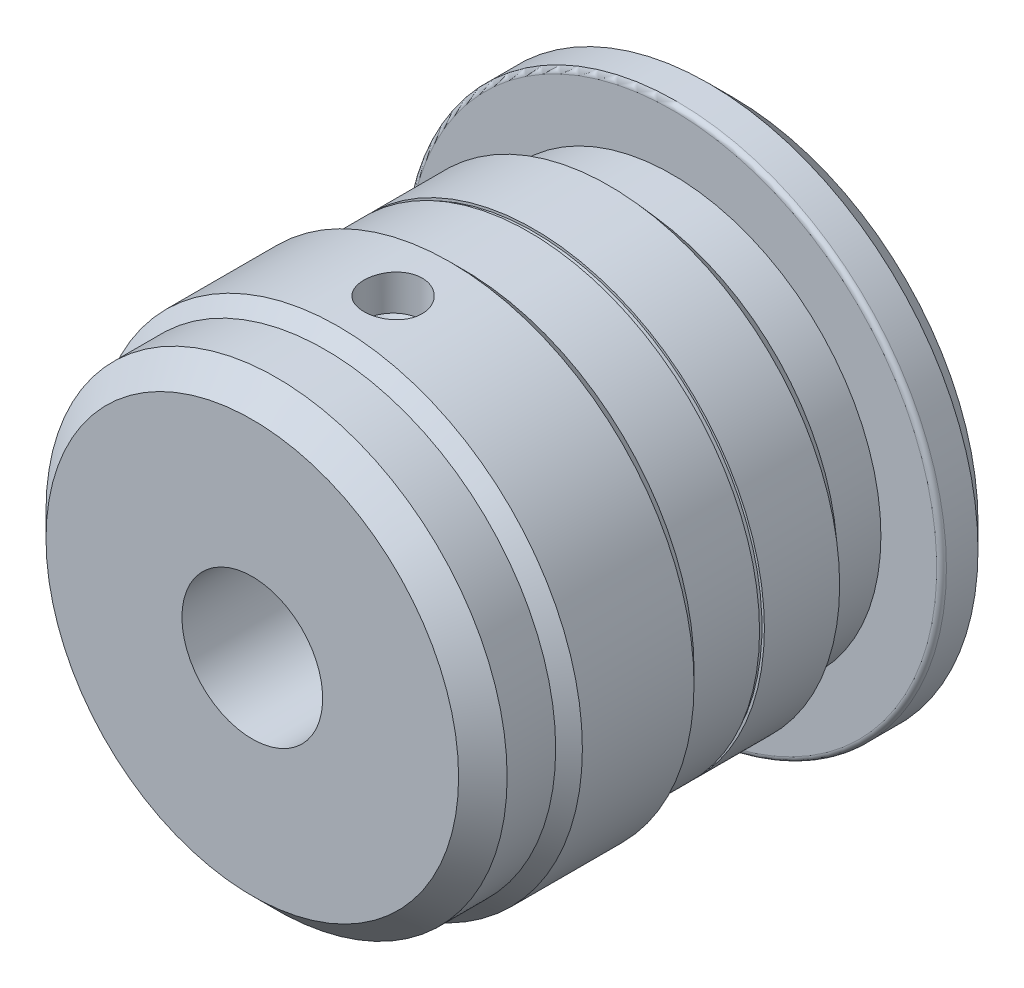
ISO-10303-21;
HEADER;
FILE_DESCRIPTION(('STEP AP214'),'2;1');
FILE_NAME('part.step','',(''),(''),'','','');
FILE_SCHEMA(('AUTOMOTIVE_DESIGN { 1 0 10303 214 1 1 1 1 }'));
ENDSEC;
DATA;
#1=APPLICATION_CONTEXT('core data for automotive mechanical design processes');
#2=APPLICATION_PROTOCOL_DEFINITION('international standard','automotive_design',2000,#1);
#3=PRODUCT_CONTEXT('',#1,'mechanical');
#4=PRODUCT('Part','Part','',(#3));
#5=PRODUCT_RELATED_PRODUCT_CATEGORY('part','',(#4));
#6=PRODUCT_DEFINITION_FORMATION('','',#4);
#7=PRODUCT_DEFINITION_CONTEXT('part definition',#1,'design');
#8=PRODUCT_DEFINITION('design','',#6,#7);
#9=PRODUCT_DEFINITION_SHAPE('','',#8);
#10=(LENGTH_UNIT() NAMED_UNIT(*) SI_UNIT(.MILLI.,.METRE.));
#11=(NAMED_UNIT(*) PLANE_ANGLE_UNIT() SI_UNIT($,.RADIAN.));
#12=(NAMED_UNIT(*) SI_UNIT($,.STERADIAN.) SOLID_ANGLE_UNIT());
#13=UNCERTAINTY_MEASURE_WITH_UNIT(LENGTH_MEASURE(1.E-05),#10,'distance_accuracy_value','');
#14=(GEOMETRIC_REPRESENTATION_CONTEXT(3) GLOBAL_UNCERTAINTY_ASSIGNED_CONTEXT((#13)) GLOBAL_UNIT_ASSIGNED_CONTEXT((#10,
#11,#12)) REPRESENTATION_CONTEXT('',''));
#15=CARTESIAN_POINT('',(0.,0.,0.));
#16=DIRECTION('',(0.,0.,1.));
#17=DIRECTION('',(1.,0.,0.));
#18=AXIS2_PLACEMENT_3D('',#15,#16,#17);
#19=CARTESIAN_POINT('',(0.,0.,0.));
#20=DIRECTION('',(0.,0.,-1.));
#21=DIRECTION('',(-1.,0.,0.));
#22=AXIS2_PLACEMENT_3D('',#19,#20,#21);
#23=CYLINDRICAL_SURFACE('',#22,9.5);
#24=CARTESIAN_POINT('',(0.,0.,5.1));
#25=DIRECTION('',(0.,0.,-1.));
#26=DIRECTION('',(-1.,0.,0.));
#27=AXIS2_PLACEMENT_3D('',#24,#25,#26);
#28=CIRCLE('',#27,9.5);
#29=CARTESIAN_POINT('',(-9.5,0.,5.1));
#30=VERTEX_POINT('',#29);
#31=EDGE_CURVE('E203',#30,#30,#28,.T.);
#32=ORIENTED_EDGE('',*,*,#31,.F.);
#33=EDGE_LOOP('',(#32));
#34=FACE_BOUND('',#33,.T.);
#35=CARTESIAN_POINT('',(0.,0.,8.2));
#36=DIRECTION('',(0.,0.,-1.));
#37=DIRECTION('',(-1.,0.,0.));
#38=AXIS2_PLACEMENT_3D('',#35,#36,#37);
#39=CIRCLE('',#38,9.5);
#40=CARTESIAN_POINT('',(-9.5,0.,8.2));
#41=VERTEX_POINT('',#40);
#42=EDGE_CURVE('E152',#41,#41,#39,.T.);
#43=ORIENTED_EDGE('',*,*,#42,.T.);
#44=EDGE_LOOP('',(#43));
#45=FACE_BOUND('',#44,.T.);
#46=ADVANCED_FACE('F31',(#34,#45),#23,.T.);
#47=CARTESIAN_POINT('',(9.5,0.,8.2));
#48=DIRECTION('',(0.,0.,-1.));
#49=DIRECTION('',(-1.,0.,0.));
#50=AXIS2_PLACEMENT_3D('',#47,#48,#49);
#51=PLANE('',#50);
#52=ORIENTED_EDGE('',*,*,#42,.F.);
#53=EDGE_LOOP('',(#52));
#54=FACE_BOUND('',#53,.T.);
#55=CARTESIAN_POINT('',(0.,0.,8.2));
#56=DIRECTION('',(0.,0.,-1.));
#57=DIRECTION('',(-1.,0.,0.));
#58=AXIS2_PLACEMENT_3D('',#55,#56,#57);
#59=CIRCLE('',#58,9.4);
#60=CARTESIAN_POINT('',(-9.4,0.,8.2));
#61=VERTEX_POINT('',#60);
#62=EDGE_CURVE('E155',#61,#61,#59,.T.);
#63=ORIENTED_EDGE('',*,*,#62,.T.);
#64=EDGE_LOOP('',(#63));
#65=FACE_BOUND('',#64,.T.);
#66=ADVANCED_FACE('F98',(#54,#65),#51,.F.);
#67=CARTESIAN_POINT('',(0.,0.,0.));
#68=DIRECTION('',(0.,0.,-1.));
#69=DIRECTION('',(-1.,0.,0.));
#70=AXIS2_PLACEMENT_3D('',#67,#68,#69);
#71=CYLINDRICAL_SURFACE('',#70,9.4);
#72=ORIENTED_EDGE('',*,*,#62,.F.);
#73=EDGE_LOOP('',(#72));
#74=FACE_BOUND('',#73,.T.);
#75=CARTESIAN_POINT('',(0.,0.,8.4));
#76=DIRECTION('',(0.,0.,-1.));
#77=DIRECTION('',(-1.,0.,0.));
#78=AXIS2_PLACEMENT_3D('',#75,#76,#77);
#79=CIRCLE('',#78,9.4);
#80=CARTESIAN_POINT('',(-9.4,0.,8.4));
#81=VERTEX_POINT('',#80);
#82=EDGE_CURVE('E158',#81,#81,#79,.T.);
#83=ORIENTED_EDGE('',*,*,#82,.T.);
#84=EDGE_LOOP('',(#83));
#85=FACE_BOUND('',#84,.T.);
#86=ADVANCED_FACE('F104',(#74,#85),#71,.T.);
#87=CARTESIAN_POINT('',(9.4,0.,8.4));
#88=DIRECTION('',(0.,0.,1.));
#89=DIRECTION('',(1.,0.,0.));
#90=AXIS2_PLACEMENT_3D('',#87,#88,#89);
#91=PLANE('',#90);
#92=ORIENTED_EDGE('',*,*,#82,.F.);
#93=EDGE_LOOP('',(#92));
#94=FACE_BOUND('',#93,.T.);
#95=CARTESIAN_POINT('',(0.,0.,8.4));
#96=DIRECTION('',(0.,0.,-1.));
#97=DIRECTION('',(-1.,0.,0.));
#98=AXIS2_PLACEMENT_3D('',#95,#96,#97);
#99=CIRCLE('',#98,9.5);
#100=CARTESIAN_POINT('',(-9.5,0.,8.4));
#101=VERTEX_POINT('',#100);
#102=EDGE_CURVE('E161',#101,#101,#99,.T.);
#103=ORIENTED_EDGE('',*,*,#102,.T.);
#104=EDGE_LOOP('',(#103));
#105=FACE_BOUND('',#104,.T.);
#106=ADVANCED_FACE('F293',(#94,#105),#91,.F.);
#107=CARTESIAN_POINT('',(0.,0.,0.));
#108=DIRECTION('',(0.,0.,-1.));
#109=DIRECTION('',(-1.,0.,0.));
#110=AXIS2_PLACEMENT_3D('',#107,#108,#109);
#111=CYLINDRICAL_SURFACE('',#110,9.5);
#112=ORIENTED_EDGE('',*,*,#102,.F.);
#113=EDGE_LOOP('',(#112));
#114=FACE_BOUND('',#113,.T.);
#115=CARTESIAN_POINT('',(0.,0.,11.1));
#116=DIRECTION('',(0.,0.,-1.));
#117=DIRECTION('',(-1.,0.,0.));
#118=AXIS2_PLACEMENT_3D('',#115,#116,#117);
#119=CIRCLE('',#118,9.5);
#120=CARTESIAN_POINT('',(-9.5,0.,11.1));
#121=VERTEX_POINT('',#120);
#122=EDGE_CURVE('E164',#121,#121,#119,.T.);
#123=ORIENTED_EDGE('',*,*,#122,.T.);
#124=EDGE_LOOP('',(#123));
#125=FACE_BOUND('',#124,.T.);
#126=ADVANCED_FACE('F281',(#114,#125),#111,.T.);
#127=CARTESIAN_POINT('',(0.,0.,11.65));
#128=DIRECTION('',(0.,0.,1.));
#129=DIRECTION('',(1.,0.,0.));
#130=AXIS2_PLACEMENT_3D('',#127,#128,#129);
#131=CONICAL_SURFACE('',#130,10.05,0.78539816339745);
#132=ORIENTED_EDGE('',*,*,#122,.F.);
#133=EDGE_LOOP('',(#132));
#134=FACE_BOUND('',#133,.T.);
#135=CARTESIAN_POINT('',(0.,0.,11.65));
#136=DIRECTION('',(0.,0.,-1.));
#137=DIRECTION('',(-1.,0.,0.));
#138=AXIS2_PLACEMENT_3D('',#135,#136,#137);
#139=CIRCLE('',#138,10.05);
#140=CARTESIAN_POINT('',(-10.05,0.,11.65));
#141=VERTEX_POINT('',#140);
#142=EDGE_CURVE('E167',#141,#141,#139,.T.);
#143=ORIENTED_EDGE('',*,*,#142,.T.);
#144=EDGE_LOOP('',(#143));
#145=FACE_BOUND('',#144,.T.);
#146=ADVANCED_FACE('F271',(#134,#145),#131,.T.);
#147=CARTESIAN_POINT('',(0.,0.,0.));
#148=DIRECTION('',(0.,0.,-1.));
#149=DIRECTION('',(-1.,0.,0.));
#150=AXIS2_PLACEMENT_3D('',#147,#148,#149);
#151=CYLINDRICAL_SURFACE('',#150,10.05);
#152=CARTESIAN_POINT('',(0.,-10.05,12.8));
#153=CARTESIAN_POINT('',(-0.067148174547686,-10.0499990980396,12.8000028671655));
#154=CARTESIAN_POINT('',(-0.134338901943771,-10.0493199152933,12.805655093297));
#155=CARTESIAN_POINT('',(-0.266852344430895,-10.0466758452994,12.8281146561561));
#156=CARTESIAN_POINT('',(-0.332173006493362,-10.0447095976035,12.8449337967607));
#157=CARTESIAN_POINT('',(-0.45900860092973,-10.0397130145762,12.8892260349725));
#158=CARTESIAN_POINT('',(-0.520526000720439,-10.0366833778367,12.916692139308));
#159=CARTESIAN_POINT('',(-0.638065988702163,-10.0298974121329,12.9814837477259));
#160=CARTESIAN_POINT('',(-0.694089553287102,-10.0261412126512,13.0188074954844));
#161=CARTESIAN_POINT('',(-0.799346215259141,-10.0183006529537,13.1024563086189));
#162=CARTESIAN_POINT('',(-0.848547629780121,-10.0142148924291,13.1488211137676));
#163=CARTESIAN_POINT('',(-0.938490602606399,-10.006187060602,13.2491506854776));
#164=CARTESIAN_POINT('',(-0.979231739836142,-10.0022449964595,13.3031158300905));
#165=CARTESIAN_POINT('',(-1.05121442346291,-9.9949370155278,13.4173184550986));
#166=CARTESIAN_POINT('',(-1.08242650882052,-9.99157289932693,13.4775746301208));
#167=CARTESIAN_POINT('',(-1.13427695962733,-9.98581996707536,13.6025200850814));
#168=CARTESIAN_POINT('',(-1.15491569175518,-9.98343111720349,13.6672092111991));
#169=CARTESIAN_POINT('',(-1.18493780860563,-9.97991242988801,13.7988566153711));
#170=CARTESIAN_POINT('',(-1.19437449585826,-9.97877663190531,13.8658025757475));
#171=CARTESIAN_POINT('',(-1.20188954614555,-9.97787435593909,14.0003368960053));
#172=CARTESIAN_POINT('',(-1.19996832733627,-9.97810782754415,14.0679252321454));
#173=CARTESIAN_POINT('',(-1.18486589846005,-9.979912257985,14.2014552325335));
#174=CARTESIAN_POINT('',(-1.17174327690291,-9.98147625740279,14.2674036305986));
#175=CARTESIAN_POINT('',(-1.13470189736666,-9.98575466390817,14.3961554535064));
#176=CARTESIAN_POINT('',(-1.11078293820473,-9.98846909243319,14.4589588197191));
#177=CARTESIAN_POINT('',(-1.05276447052413,-9.99475043280571,14.5798205791961));
#178=CARTESIAN_POINT('',(-1.01863937269601,-9.99831948286243,14.6378665729165));
#179=CARTESIAN_POINT('',(-0.941195638572598,-10.0059062390156,14.7474300482585));
#180=CARTESIAN_POINT('',(-0.897876618449436,-10.00992396384,14.798947257173));
#181=CARTESIAN_POINT('',(-0.802949392850039,-10.0179863340701,14.8943309405947));
#182=CARTESIAN_POINT('',(-0.751290662989362,-10.0220309895451,14.9381471473376));
#183=CARTESIAN_POINT('',(-0.641324738532321,-10.0296677500967,15.0164940840512));
#184=CARTESIAN_POINT('',(-0.583017530800915,-10.0332598542792,15.0510247956766));
#185=CARTESIAN_POINT('',(-0.461371968650865,-10.0395887370687,15.1098200792903));
#186=CARTESIAN_POINT('',(-0.398032149282276,-10.0423252654725,15.1340816489201));
#187=CARTESIAN_POINT('',(-0.268137770777552,-10.046632339105,15.1716107931992));
#188=CARTESIAN_POINT('',(-0.201583349024721,-10.0482029341155,15.1848788372426));
#189=CARTESIAN_POINT('',(-0.0675838043384279,-10.0499947268935,15.1999794839511));
#190=CARTESIAN_POINT('',(-0.000146593073357631,-10.0502240990276,15.2018813616919));
#191=CARTESIAN_POINT('',(0.134085593290674,-10.0493296359246,15.1943782954042));
#192=CARTESIAN_POINT('',(0.200880580818864,-10.0482058269295,15.184973570643));
#193=CARTESIAN_POINT('',(0.331728930112509,-10.0447363949162,15.1551817975449));
#194=CARTESIAN_POINT('',(0.395789884929506,-10.0423944313635,15.1348276362425));
#195=CARTESIAN_POINT('',(0.519588892769537,-10.0367510109728,15.0837488653371));
#196=CARTESIAN_POINT('',(0.579326810741252,-10.0334495241756,15.0530239319215));
#197=CARTESIAN_POINT('',(0.693094325370872,-10.0262350338563,14.9819071609014));
#198=CARTESIAN_POINT('',(0.747095621536758,-10.022319215089,14.9414703406206));
#199=CARTESIAN_POINT('',(0.847569417547473,-10.0143233034519,14.8521414939592));
#200=CARTESIAN_POINT('',(0.894041645466489,-10.0102432046555,14.8032491623245));
#201=CARTESIAN_POINT('',(0.978382646507602,-10.0023535127208,14.6980927004719));
#202=CARTESIAN_POINT('',(1.01620560730131,-9.99854543026245,14.6417916966357));
#203=CARTESIAN_POINT('',(1.0818583093201,-9.99165536429373,14.523595707527));
#204=CARTESIAN_POINT('',(1.1096882359155,-9.98857336731483,14.4617008260474));
#205=CARTESIAN_POINT('',(1.15449009427622,-9.98349453950619,14.3342241181527));
#206=CARTESIAN_POINT('',(1.17148820110634,-9.9814950944657,14.2686515995658));
#207=CARTESIAN_POINT('',(1.19422836279009,-9.97880012249898,14.1355576770989));
#208=CARTESIAN_POINT('',(1.19997089190237,-9.97810454063396,14.0680363554542));
#209=CARTESIAN_POINT('',(1.20002870519294,-9.97809755141118,13.9334171573204));
#210=CARTESIAN_POINT('',(1.19441595750275,-9.97877742660167,13.8663193007626));
#211=CARTESIAN_POINT('',(1.17207457827533,-9.98142604309079,13.7340276696311));
#212=CARTESIAN_POINT('',(1.15534594243378,-9.98339478488848,13.6688338957947));
#213=CARTESIAN_POINT('',(1.11126953255323,-9.9883966793423,13.5422083811456));
#214=CARTESIAN_POINT('',(1.08392490409959,-9.99142951667462,13.4807755321838));
#215=CARTESIAN_POINT('',(1.0193998420265,-9.99821842967417,13.3633589858769));
#216=CARTESIAN_POINT('',(0.982219327986125,-10.0019745112548,13.3073753330911));
#217=CARTESIAN_POINT('',(0.898809963292552,-10.0098152340474,13.2020781320763));
#218=CARTESIAN_POINT('',(0.852527445099682,-10.0139017349773,13.1528072316124));
#219=CARTESIAN_POINT('',(0.752338951018241,-10.0219262700774,13.062702967186));
#220=CARTESIAN_POINT('',(0.69843117394466,-10.0258642688902,13.021871602376));
#221=CARTESIAN_POINT('',(0.584308961114329,-10.0331630696409,12.9496861845422));
#222=CARTESIAN_POINT('',(0.524073222239766,-10.0365218143469,12.9183656215143));
#223=CARTESIAN_POINT('',(0.399191873205874,-10.0422625512423,12.8663281739873));
#224=CARTESIAN_POINT('',(0.334551187493858,-10.0446456139454,12.8455996617077));
#225=CARTESIAN_POINT('',(0.224640100556998,-10.0475860690572,12.820347083997));
#226=CARTESIAN_POINT('',(0.180065277641851,-10.0484869293814,12.8127277604256));
#227=CARTESIAN_POINT('',(0.0903333876678823,-10.0496941963293,12.8025532704295));
#228=CARTESIAN_POINT('',(0.0451763244042417,-10.050000606826,12.7999980710123));
#229=CARTESIAN_POINT('',(0.,-10.05,12.8));
#230=B_SPLINE_CURVE_WITH_KNOTS('',3,(#152,#153,#154,#155,#156,#157,#158,#159,#160,#161,#162,
#163,#164,#165,#166,#167,#168,#169,#170,#171,#172,#173,#174,#175,#176,#177,#178,#179,#180,#181,
#182,#183,#184,#185,#186,#187,#188,#189,#190,#191,#192,#193,#194,#195,#196,#197,#198,#199,#200,
#201,#202,#203,#204,#205,#206,#207,#208,#209,#210,#211,#212,#213,#214,#215,#216,#217,#218,#219,
#220,#221,#222,#223,#224,#225,#226,#227,#228,#229),.UNSPECIFIED.,.T.,.F.,(4,2,2,2,2,2,2,2,2,2,2,
2,2,2,2,2,2,2,2,2,2,2,2,2,2,2,2,2,2,2,2,2,2,2,2,2,2,2,4),(0.,0.201279520700456,
0.402772141386877,0.604132638813257,0.805457284263171,1.00768765013429,1.20992807878021,
1.41278758734242,1.61564006036121,1.8175233841051,2.01939927529881,2.22022568737143,
2.42105584186952,2.62239380962287,2.82374018448779,3.0263556096409,3.22897143509747,
3.43164645789182,3.63431282656161,3.83574270409987,4.03716867540141,4.23799300696924,
4.43882360956696,4.64060297627979,4.84238962899281,5.04522152482005,5.24804965793063,
5.45038577989424,5.65271337615427,5.85376266624638,6.05481203418936,6.25580187535136,
6.45679335991259,6.65900752932416,6.86126954435847,7.06423573095859,7.26697862331232,
7.40239746716907,7.53781542877927),.UNSPECIFIED.);
#231=CARTESIAN_POINT('',(0.,-10.05,12.8));
#232=VERTEX_POINT('',#231);
#233=EDGE_CURVE('E42',#232,#232,#230,.T.);
#234=ORIENTED_EDGE('',*,*,#233,.T.);
#235=EDGE_LOOP('',(#234));
#236=FACE_BOUND('',#235,.T.);
#237=CARTESIAN_POINT('',(0.,10.05,15.2));
#238=CARTESIAN_POINT('',(-0.067148174547686,10.0499990980396,15.1999971328345));
#239=CARTESIAN_POINT('',(-0.134338901943771,10.0493199152933,15.194344906703));
#240=CARTESIAN_POINT('',(-0.266852344430895,10.0466758452994,15.1718853438439));
#241=CARTESIAN_POINT('',(-0.332173006493362,10.0447095976035,15.1550662032393));
#242=CARTESIAN_POINT('',(-0.45900860092973,10.0397130145762,15.1107739650275));
#243=CARTESIAN_POINT('',(-0.520526000720439,10.0366833778367,15.083307860692));
#244=CARTESIAN_POINT('',(-0.638065988702163,10.0298974121329,15.0185162522741));
#245=CARTESIAN_POINT('',(-0.694089553287101,10.0261412126512,14.9811925045156));
#246=CARTESIAN_POINT('',(-0.79934621525914,10.0183006529537,14.8975436913811));
#247=CARTESIAN_POINT('',(-0.84854762978012,10.0142148924291,14.8511788862324));
#248=CARTESIAN_POINT('',(-0.938490602606398,10.006187060602,14.7508493145224));
#249=CARTESIAN_POINT('',(-0.979231739836141,10.0022449964595,14.6968841699095));
#250=CARTESIAN_POINT('',(-1.05121442346291,9.9949370155278,14.5826815449013));
#251=CARTESIAN_POINT('',(-1.08242650882051,9.99157289932693,14.5224253698792));
#252=CARTESIAN_POINT('',(-1.13427695962733,9.98581996707536,14.3974799149186));
#253=CARTESIAN_POINT('',(-1.15491569175518,9.98343111720349,14.3327907888009));
#254=CARTESIAN_POINT('',(-1.18493780860563,9.97991242988801,14.2011433846289));
#255=CARTESIAN_POINT('',(-1.19437449585825,9.97877663190531,14.1341974242525));
#256=CARTESIAN_POINT('',(-1.20188954614555,9.97787435593909,13.9996631039947));
#257=CARTESIAN_POINT('',(-1.19996832733626,9.97810782754415,13.9320747678546));
#258=CARTESIAN_POINT('',(-1.18486589846005,9.979912257985,13.7985447674665));
#259=CARTESIAN_POINT('',(-1.17174327690291,9.98147625740279,13.7325963694014));
#260=CARTESIAN_POINT('',(-1.13470189736665,9.98575466390817,13.6038445464936));
#261=CARTESIAN_POINT('',(-1.11078293820473,9.98846909243319,13.5410411802809));
#262=CARTESIAN_POINT('',(-1.05276447052412,9.99475043280571,13.4201794208039));
#263=CARTESIAN_POINT('',(-1.018639372696,9.99831948286243,13.3621334270835));
#264=CARTESIAN_POINT('',(-0.941195638572592,10.0059062390156,13.2525699517415));
#265=CARTESIAN_POINT('',(-0.89787661844943,10.00992396384,13.201052742827));
#266=CARTESIAN_POINT('',(-0.802949392850033,10.0179863340701,13.1056690594053));
#267=CARTESIAN_POINT('',(-0.751290662989355,10.0220309895451,13.0618528526624));
#268=CARTESIAN_POINT('',(-0.641324738532315,10.0296677500967,12.9835059159488));
#269=CARTESIAN_POINT('',(-0.583017530800908,10.0332598542792,12.9489752043234));
#270=CARTESIAN_POINT('',(-0.461371968650858,10.0395887370687,12.8901799207097));
#271=CARTESIAN_POINT('',(-0.398032149282269,10.0423252654725,12.8659183510799));
#272=CARTESIAN_POINT('',(-0.268137770777545,10.046632339105,12.8283892068008));
#273=CARTESIAN_POINT('',(-0.201583349024714,10.0482029341155,12.8151211627574));
#274=CARTESIAN_POINT('',(-0.0675838043384205,10.0499947268935,12.8000205160489));
#275=CARTESIAN_POINT('',(-0.000146593073350394,10.0502240990276,12.7981186383081));
#276=CARTESIAN_POINT('',(0.134085593290681,10.0493296359246,12.8056217045958));
#277=CARTESIAN_POINT('',(0.200880580818871,10.0482058269295,12.815026429357));
#278=CARTESIAN_POINT('',(0.331728930112516,10.0447363949162,12.8448182024551));
#279=CARTESIAN_POINT('',(0.395789884929513,10.0423944313635,12.8651723637575));
#280=CARTESIAN_POINT('',(0.519588892769544,10.0367510109728,12.916251134663));
#281=CARTESIAN_POINT('',(0.579326810741259,10.0334495241756,12.9469760680785));
#282=CARTESIAN_POINT('',(0.693094325370879,10.0262350338563,13.0180928390986));
#283=CARTESIAN_POINT('',(0.747095621536765,10.022319215089,13.0585296593794));
#284=CARTESIAN_POINT('',(0.84756941754748,10.0143233034519,13.1478585060408));
#285=CARTESIAN_POINT('',(0.894041645466496,10.0102432046555,13.1967508376755));
#286=CARTESIAN_POINT('',(0.978382646507608,10.0023535127208,13.3019072995281));
#287=CARTESIAN_POINT('',(1.01620560730132,9.99854543026245,13.3582083033643));
#288=CARTESIAN_POINT('',(1.08185830932011,9.99165536429373,13.476404292473));
#289=CARTESIAN_POINT('',(1.10968823591551,9.98857336731483,13.5382991739526));
#290=CARTESIAN_POINT('',(1.15449009427622,9.98349453950619,13.6657758818473));
#291=CARTESIAN_POINT('',(1.17148820110634,9.9814950944657,13.7313484004343));
#292=CARTESIAN_POINT('',(1.19422836279009,9.97880012249898,13.8644423229011));
#293=CARTESIAN_POINT('',(1.19997089190237,9.97810454063396,13.9319636445458));
#294=CARTESIAN_POINT('',(1.20002870519294,9.97809755141118,14.0665828426796));
#295=CARTESIAN_POINT('',(1.19441595750275,9.97877742660167,14.1336806992374));
#296=CARTESIAN_POINT('',(1.17207457827533,9.98142604309079,14.2659723303689));
#297=CARTESIAN_POINT('',(1.15534594243379,9.98339478488848,14.3311661042054));
#298=CARTESIAN_POINT('',(1.11126953255323,9.9883966793423,14.4577916188544));
#299=CARTESIAN_POINT('',(1.08392490409959,9.99142951667462,14.5192244678163));
#300=CARTESIAN_POINT('',(1.0193998420265,9.99821842967417,14.6366410141231));
#301=CARTESIAN_POINT('',(0.982219327986126,10.0019745112548,14.6926246669089));
#302=CARTESIAN_POINT('',(0.898809963292553,10.0098152340474,14.7979218679237));
#303=CARTESIAN_POINT('',(0.852527445099683,10.0139017349773,14.8471927683876));
#304=CARTESIAN_POINT('',(0.752338951018242,10.0219262700774,14.937297032814));
#305=CARTESIAN_POINT('',(0.69843117394466,10.0258642688902,14.978128397624));
#306=CARTESIAN_POINT('',(0.58430896111433,10.0331630696409,15.0503138154578));
#307=CARTESIAN_POINT('',(0.524073222239766,10.0365218143469,15.0816343784857));
#308=CARTESIAN_POINT('',(0.399191873205874,10.0422625512423,15.1336718260127));
#309=CARTESIAN_POINT('',(0.334551187493858,10.0446456139454,15.1544003382923));
#310=CARTESIAN_POINT('',(0.224640100556998,10.0475860690572,15.179652916003));
#311=CARTESIAN_POINT('',(0.180065277641851,10.0484869293814,15.1872722395744));
#312=CARTESIAN_POINT('',(0.0903333876678822,10.0496941963293,15.1974467295705));
#313=CARTESIAN_POINT('',(0.0451763244042417,10.050000606826,15.2000019289877));
#314=CARTESIAN_POINT('',(0.,10.05,15.2));
#315=B_SPLINE_CURVE_WITH_KNOTS('',3,(#237,#238,#239,#240,#241,#242,#243,#244,#245,#246,#247,
#248,#249,#250,#251,#252,#253,#254,#255,#256,#257,#258,#259,#260,#261,#262,#263,#264,#265,#266,
#267,#268,#269,#270,#271,#272,#273,#274,#275,#276,#277,#278,#279,#280,#281,#282,#283,#284,#285,
#286,#287,#288,#289,#290,#291,#292,#293,#294,#295,#296,#297,#298,#299,#300,#301,#302,#303,#304,
#305,#306,#307,#308,#309,#310,#311,#312,#313,#314),.UNSPECIFIED.,.T.,.F.,(4,2,2,2,2,2,2,2,2,2,2,
2,2,2,2,2,2,2,2,2,2,2,2,2,2,2,2,2,2,2,2,2,2,2,2,2,2,2,4),(0.,0.201279520700456,
0.402772141386877,0.604132638813258,0.805457284263171,1.00768765013429,1.20992807878021,
1.41278758734242,1.61564006036121,1.8175233841051,2.01939927529881,2.22022568737143,
2.42105584186952,2.62239380962287,2.82374018448779,3.0263556096409,3.22897143509747,
3.43164645789182,3.63431282656161,3.83574270409987,4.03716867540141,4.23799300696924,
4.43882360956696,4.64060297627979,4.84238962899281,5.04522152482006,5.24804965793063,
5.45038577989424,5.65271337615427,5.85376266624638,6.05481203418936,6.25580187535136,
6.45679335991259,6.65900752932416,6.86126954435847,7.06423573095859,7.26697862331232,
7.40239746716907,7.53781542877927),.UNSPECIFIED.);
#316=CARTESIAN_POINT('',(0.,10.05,15.2));
#317=VERTEX_POINT('',#316);
#318=EDGE_CURVE('E78',#317,#317,#315,.T.);
#319=ORIENTED_EDGE('',*,*,#318,.T.);
#320=EDGE_LOOP('',(#319));
#321=FACE_BOUND('',#320,.T.);
#322=ORIENTED_EDGE('',*,*,#142,.F.);
#323=EDGE_LOOP('',(#322));
#324=FACE_BOUND('',#323,.T.);
#325=CARTESIAN_POINT('',(0.,0.,16.25));
#326=DIRECTION('',(0.,0.,-1.));
#327=DIRECTION('',(-1.,0.,0.));
#328=AXIS2_PLACEMENT_3D('',#325,#326,#327);
#329=CIRCLE('',#328,10.05);
#330=CARTESIAN_POINT('',(-10.05,0.,16.25));
#331=VERTEX_POINT('',#330);
#332=EDGE_CURVE('E170',#331,#331,#329,.T.);
#333=ORIENTED_EDGE('',*,*,#332,.T.);
#334=EDGE_LOOP('',(#333));
#335=FACE_BOUND('',#334,.T.);
#336=ADVANCED_FACE('F54',(#236,#321,#324,#335),#151,.T.);
#337=CARTESIAN_POINT('',(0.,0.,16.8));
#338=DIRECTION('',(0.,0.,-1.));
#339=DIRECTION('',(-1.,0.,0.));
#340=AXIS2_PLACEMENT_3D('',#337,#338,#339);
#341=CONICAL_SURFACE('',#340,9.5,0.785398163397453);
#342=ORIENTED_EDGE('',*,*,#332,.F.);
#343=EDGE_LOOP('',(#342));
#344=FACE_BOUND('',#343,.T.);
#345=CARTESIAN_POINT('',(0.,0.,16.8));
#346=DIRECTION('',(0.,0.,-1.));
#347=DIRECTION('',(-1.,0.,0.));
#348=AXIS2_PLACEMENT_3D('',#345,#346,#347);
#349=CIRCLE('',#348,9.5);
#350=CARTESIAN_POINT('',(-9.5,0.,16.8));
#351=VERTEX_POINT('',#350);
#352=EDGE_CURVE('E173',#351,#351,#349,.T.);
#353=ORIENTED_EDGE('',*,*,#352,.T.);
#354=EDGE_LOOP('',(#353));
#355=FACE_BOUND('',#354,.T.);
#356=ADVANCED_FACE('F264',(#344,#355),#341,.T.);
#357=CARTESIAN_POINT('',(0.,0.,0.));
#358=DIRECTION('',(0.,0.,-1.));
#359=DIRECTION('',(-1.,0.,0.));
#360=AXIS2_PLACEMENT_3D('',#357,#358,#359);
#361=CYLINDRICAL_SURFACE('',#360,9.5);
#362=CARTESIAN_POINT('',(0.,0.,18.8));
#363=DIRECTION('',(0.,0.,-1.));
#364=DIRECTION('',(-1.,0.,0.));
#365=AXIS2_PLACEMENT_3D('',#362,#363,#364);
#366=CIRCLE('',#365,9.5);
#367=CARTESIAN_POINT('',(-9.5,0.,18.8));
#368=VERTEX_POINT('',#367);
#369=EDGE_CURVE('E149',#368,#368,#366,.T.);
#370=ORIENTED_EDGE('',*,*,#369,.T.);
#371=EDGE_LOOP('',(#370));
#372=FACE_BOUND('',#371,.T.);
#373=ORIENTED_EDGE('',*,*,#352,.F.);
#374=EDGE_LOOP('',(#373));
#375=FACE_BOUND('',#374,.T.);
#376=ADVANCED_FACE('F261',(#372,#375),#361,.T.);
#377=CARTESIAN_POINT('',(9.5,0.,19.8));
#378=DIRECTION('',(0.,0.,-1.));
#379=DIRECTION('',(-1.,0.,0.));
#380=AXIS2_PLACEMENT_3D('',#377,#378,#379);
#381=PLANE('',#380);
#382=CARTESIAN_POINT('',(0.,0.,19.8));
#383=DIRECTION('',(0.,0.,-1.));
#384=DIRECTION('',(-1.,0.,0.));
#385=AXIS2_PLACEMENT_3D('',#382,#383,#384);
#386=CIRCLE('',#385,8.5);
#387=CARTESIAN_POINT('',(-8.5,0.,19.8));
#388=VERTEX_POINT('',#387);
#389=EDGE_CURVE('E146',#388,#388,#386,.F.);
#390=ORIENTED_EDGE('',*,*,#389,.T.);
#391=EDGE_LOOP('',(#390));
#392=FACE_BOUND('',#391,.T.);
#393=CARTESIAN_POINT('',(0.,0.,19.8));
#394=DIRECTION('',(0.,0.,-1.));
#395=DIRECTION('',(-1.,0.,0.));
#396=AXIS2_PLACEMENT_3D('',#393,#394,#395);
#397=CIRCLE('',#396,2.9);
#398=CARTESIAN_POINT('',(-2.9,0.,19.8));
#399=VERTEX_POINT('',#398);
#400=EDGE_CURVE('E176',#399,#399,#397,.T.);
#401=ORIENTED_EDGE('',*,*,#400,.T.);
#402=EDGE_LOOP('',(#401));
#403=FACE_BOUND('',#402,.T.);
#404=ADVANCED_FACE('F257',(#392,#403),#381,.F.);
#405=CARTESIAN_POINT('',(0.,0.,0.));
#406=DIRECTION('',(0.,0.,-1.));
#407=DIRECTION('',(-1.,0.,0.));
#408=AXIS2_PLACEMENT_3D('',#405,#406,#407);
#409=CYLINDRICAL_SURFACE('',#408,2.9);
#410=ORIENTED_EDGE('',*,*,#400,.F.);
#411=EDGE_LOOP('',(#410));
#412=FACE_BOUND('',#411,.T.);
#413=CARTESIAN_POINT('',(0.,0.,11.8));
#414=DIRECTION('',(0.,0.,-1.));
#415=DIRECTION('',(-1.,0.,0.));
#416=AXIS2_PLACEMENT_3D('',#413,#414,#415);
#417=CIRCLE('',#416,2.9);
#418=CARTESIAN_POINT('',(-2.9,0.,11.8));
#419=VERTEX_POINT('',#418);
#420=EDGE_CURVE('E179',#419,#419,#417,.T.);
#421=ORIENTED_EDGE('',*,*,#420,.T.);
#422=EDGE_LOOP('',(#421));
#423=FACE_BOUND('',#422,.T.);
#424=ADVANCED_FACE('F253',(#412,#423),#409,.F.);
#425=CARTESIAN_POINT('',(2.9,0.,11.8));
#426=DIRECTION('',(0.,0.,1.));
#427=DIRECTION('',(1.,0.,0.));
#428=AXIS2_PLACEMENT_3D('',#425,#426,#427);
#429=PLANE('',#428);
#430=ORIENTED_EDGE('',*,*,#420,.F.);
#431=EDGE_LOOP('',(#430));
#432=FACE_BOUND('',#431,.T.);
#433=CARTESIAN_POINT('',(0.,0.,11.8));
#434=DIRECTION('',(0.,0.,-1.));
#435=DIRECTION('',(-1.,0.,0.));
#436=AXIS2_PLACEMENT_3D('',#433,#434,#435);
#437=CIRCLE('',#436,4.4);
#438=CARTESIAN_POINT('',(-4.4,0.,11.8));
#439=VERTEX_POINT('',#438);
#440=EDGE_CURVE('E182',#439,#439,#437,.T.);
#441=ORIENTED_EDGE('',*,*,#440,.T.);
#442=EDGE_LOOP('',(#441));
#443=FACE_BOUND('',#442,.T.);
#444=ADVANCED_FACE('F249',(#432,#443),#429,.F.);
#445=CARTESIAN_POINT('',(0.,0.,0.));
#446=DIRECTION('',(0.,0.,-1.));
#447=DIRECTION('',(-1.,0.,0.));
#448=AXIS2_PLACEMENT_3D('',#445,#446,#447);
#449=CYLINDRICAL_SURFACE('',#448,4.4);
#450=ORIENTED_EDGE('',*,*,#440,.F.);
#451=EDGE_LOOP('',(#450));
#452=FACE_BOUND('',#451,.T.);
#453=CARTESIAN_POINT('',(0.,0.,10.));
#454=DIRECTION('',(0.,0.,-1.));
#455=DIRECTION('',(-1.,0.,0.));
#456=AXIS2_PLACEMENT_3D('',#453,#454,#455);
#457=CIRCLE('',#456,4.4);
#458=CARTESIAN_POINT('',(-4.4,0.,10.));
#459=VERTEX_POINT('',#458);
#460=EDGE_CURVE('E185',#459,#459,#457,.T.);
#461=ORIENTED_EDGE('',*,*,#460,.T.);
#462=EDGE_LOOP('',(#461));
#463=FACE_BOUND('',#462,.T.);
#464=ADVANCED_FACE('F245',(#452,#463),#449,.F.);
#465=CARTESIAN_POINT('',(4.4,0.,10.));
#466=DIRECTION('',(0.,0.,-1.));
#467=DIRECTION('',(-1.,0.,0.));
#468=AXIS2_PLACEMENT_3D('',#465,#466,#467);
#469=PLANE('',#468);
#470=ORIENTED_EDGE('',*,*,#460,.F.);
#471=EDGE_LOOP('',(#470));
#472=FACE_BOUND('',#471,.T.);
#473=CARTESIAN_POINT('',(0.,0.,10.));
#474=DIRECTION('',(0.,0.,-1.));
#475=DIRECTION('',(-1.,0.,0.));
#476=AXIS2_PLACEMENT_3D('',#473,#474,#475);
#477=CIRCLE('',#476,3.4);
#478=CARTESIAN_POINT('',(-3.4,0.,10.));
#479=VERTEX_POINT('',#478);
#480=EDGE_CURVE('E188',#479,#479,#477,.T.);
#481=ORIENTED_EDGE('',*,*,#480,.T.);
#482=EDGE_LOOP('',(#481));
#483=FACE_BOUND('',#482,.T.);
#484=ADVANCED_FACE('F241',(#472,#483),#469,.F.);
#485=CARTESIAN_POINT('',(0.,0.,0.));
#486=DIRECTION('',(0.,0.,-1.));
#487=DIRECTION('',(-1.,0.,0.));
#488=AXIS2_PLACEMENT_3D('',#485,#486,#487);
#489=CYLINDRICAL_SURFACE('',#488,3.4);
#490=ORIENTED_EDGE('',*,*,#480,.F.);
#491=EDGE_LOOP('',(#490));
#492=FACE_BOUND('',#491,.T.);
#493=CARTESIAN_POINT('',(0.,0.,8.5));
#494=DIRECTION('',(0.,0.,-1.));
#495=DIRECTION('',(-1.,0.,0.));
#496=AXIS2_PLACEMENT_3D('',#493,#494,#495);
#497=CIRCLE('',#496,3.4);
#498=CARTESIAN_POINT('',(-3.4,0.,8.5));
#499=VERTEX_POINT('',#498);
#500=EDGE_CURVE('E191',#499,#499,#497,.T.);
#501=ORIENTED_EDGE('',*,*,#500,.T.);
#502=EDGE_LOOP('',(#501));
#503=FACE_BOUND('',#502,.T.);
#504=ADVANCED_FACE('F237',(#492,#503),#489,.F.);
#505=CARTESIAN_POINT('',(0.,0.,7.77653718043598));
#506=DIRECTION('',(0.,0.,-1.));
#507=DIRECTION('',(-1.,0.,0.));
#508=AXIS2_PLACEMENT_3D('',#505,#506,#507);
#509=CONICAL_SURFACE('',#508,6.1,1.30899693899575);
#510=ORIENTED_EDGE('',*,*,#500,.F.);
#511=EDGE_LOOP('',(#510));
#512=FACE_BOUND('',#511,.T.);
#513=CARTESIAN_POINT('',(0.,0.,7.77653718043598));
#514=DIRECTION('',(0.,0.,-1.));
#515=DIRECTION('',(-1.,0.,0.));
#516=AXIS2_PLACEMENT_3D('',#513,#514,#515);
#517=CIRCLE('',#516,6.1);
#518=CARTESIAN_POINT('',(-6.1,0.,7.77653718043598));
#519=VERTEX_POINT('',#518);
#520=EDGE_CURVE('E194',#519,#519,#517,.T.);
#521=ORIENTED_EDGE('',*,*,#520,.T.);
#522=EDGE_LOOP('',(#521));
#523=FACE_BOUND('',#522,.T.);
#524=ADVANCED_FACE('F233',(#512,#523),#509,.F.);
#525=CARTESIAN_POINT('',(0.,0.,0.));
#526=DIRECTION('',(0.,0.,-1.));
#527=DIRECTION('',(-1.,0.,0.));
#528=AXIS2_PLACEMENT_3D('',#525,#526,#527);
#529=CYLINDRICAL_SURFACE('',#528,6.1);
#530=CARTESIAN_POINT('',(0.,0.,0.999999999999996));
#531=DIRECTION('',(0.,0.,1.));
#532=DIRECTION('',(1.,0.,0.));
#533=AXIS2_PLACEMENT_3D('',#530,#531,#532);
#534=CIRCLE('',#533,6.1);
#535=CARTESIAN_POINT('',(6.1,0.,0.999999999999996));
#536=VERTEX_POINT('',#535);
#537=EDGE_CURVE('E143',#536,#536,#534,.F.);
#538=ORIENTED_EDGE('',*,*,#537,.T.);
#539=EDGE_LOOP('',(#538));
#540=FACE_BOUND('',#539,.T.);
#541=ORIENTED_EDGE('',*,*,#520,.F.);
#542=EDGE_LOOP('',(#541));
#543=FACE_BOUND('',#542,.T.);
#544=ADVANCED_FACE('F229',(#540,#543),#529,.F.);
#545=CARTESIAN_POINT('',(11.1,0.,0.));
#546=DIRECTION('',(0.,0.,1.));
#547=DIRECTION('',(1.,0.,0.));
#548=AXIS2_PLACEMENT_3D('',#545,#546,#547);
#549=PLANE('',#548);
#550=CARTESIAN_POINT('',(0.,0.,0.));
#551=DIRECTION('',(0.,0.,1.));
#552=DIRECTION('',(1.,0.,0.));
#553=AXIS2_PLACEMENT_3D('',#550,#551,#552);
#554=CIRCLE('',#553,10.1);
#555=CARTESIAN_POINT('',(10.1,0.,0.));
#556=VERTEX_POINT('',#555);
#557=EDGE_CURVE('E135',#556,#556,#554,.F.);
#558=ORIENTED_EDGE('',*,*,#557,.T.);
#559=EDGE_LOOP('',(#558));
#560=FACE_BOUND('',#559,.T.);
#561=CARTESIAN_POINT('',(0.,0.,0.));
#562=DIRECTION('',(0.,0.,1.));
#563=DIRECTION('',(1.,0.,0.));
#564=AXIS2_PLACEMENT_3D('',#561,#562,#563);
#565=CIRCLE('',#564,7.1);
#566=CARTESIAN_POINT('',(7.1,0.,0.));
#567=VERTEX_POINT('',#566);
#568=EDGE_CURVE('E140',#567,#567,#565,.T.);
#569=ORIENTED_EDGE('',*,*,#568,.T.);
#570=EDGE_LOOP('',(#569));
#571=FACE_BOUND('',#570,.T.);
#572=ADVANCED_FACE('F226',(#560,#571),#549,.F.);
#573=CARTESIAN_POINT('',(0.,0.,0.));
#574=DIRECTION('',(0.,0.,-1.));
#575=DIRECTION('',(-1.,0.,0.));
#576=AXIS2_PLACEMENT_3D('',#573,#574,#575);
#577=CYLINDRICAL_SURFACE('',#576,11.1);
#578=CARTESIAN_POINT('',(0.,0.,2.3));
#579=DIRECTION('',(0.,0.,-1.));
#580=DIRECTION('',(-1.,0.,0.));
#581=AXIS2_PLACEMENT_3D('',#578,#579,#580);
#582=CIRCLE('',#581,11.1);
#583=CARTESIAN_POINT('',(-11.1,0.,2.3));
#584=VERTEX_POINT('',#583);
#585=EDGE_CURVE('E131',#584,#584,#582,.T.);
#586=ORIENTED_EDGE('',*,*,#585,.T.);
#587=EDGE_LOOP('',(#586));
#588=FACE_BOUND('',#587,.T.);
#589=CARTESIAN_POINT('',(0.,0.,1.));
#590=DIRECTION('',(0.,0.,1.));
#591=DIRECTION('',(1.,0.,0.));
#592=AXIS2_PLACEMENT_3D('',#589,#590,#591);
#593=CIRCLE('',#592,11.1);
#594=CARTESIAN_POINT('',(11.1,0.,1.));
#595=VERTEX_POINT('',#594);
#596=EDGE_CURVE('E133',#595,#595,#593,.T.);
#597=ORIENTED_EDGE('',*,*,#596,.T.);
#598=EDGE_LOOP('',(#597));
#599=FACE_BOUND('',#598,.T.);
#600=ADVANCED_FACE('F219',(#588,#599),#577,.T.);
#601=CARTESIAN_POINT('',(11.1,0.,2.5));
#602=DIRECTION('',(0.,0.,-1.));
#603=DIRECTION('',(-1.,0.,0.));
#604=AXIS2_PLACEMENT_3D('',#601,#602,#603);
#605=PLANE('',#604);
#606=CARTESIAN_POINT('',(0.,0.,2.5));
#607=DIRECTION('',(0.,0.,-1.));
#608=DIRECTION('',(-1.,0.,0.));
#609=AXIS2_PLACEMENT_3D('',#606,#607,#608);
#610=CIRCLE('',#609,10.9);
#611=CARTESIAN_POINT('',(-10.9,0.,2.5));
#612=VERTEX_POINT('',#611);
#613=EDGE_CURVE('E84',#612,#612,#610,.F.);
#614=ORIENTED_EDGE('',*,*,#613,.T.);
#615=EDGE_LOOP('',(#614));
#616=FACE_BOUND('',#615,.T.);
#617=CARTESIAN_POINT('',(0.,0.,2.5));
#618=DIRECTION('',(0.,0.,-1.));
#619=DIRECTION('',(-1.,0.,0.));
#620=AXIS2_PLACEMENT_3D('',#617,#618,#619);
#621=CIRCLE('',#620,8.6);
#622=CARTESIAN_POINT('',(-8.6,0.,2.5));
#623=VERTEX_POINT('',#622);
#624=EDGE_CURVE('E197',#623,#623,#621,.T.);
#625=ORIENTED_EDGE('',*,*,#624,.T.);
#626=EDGE_LOOP('',(#625));
#627=FACE_BOUND('',#626,.T.);
#628=ADVANCED_FACE('F212',(#616,#627),#605,.F.);
#629=CARTESIAN_POINT('',(0.,0.,0.));
#630=DIRECTION('',(0.,0.,-1.));
#631=DIRECTION('',(-1.,0.,0.));
#632=AXIS2_PLACEMENT_3D('',#629,#630,#631);
#633=CYLINDRICAL_SURFACE('',#632,8.6);
#634=ORIENTED_EDGE('',*,*,#624,.F.);
#635=EDGE_LOOP('',(#634));
#636=FACE_BOUND('',#635,.T.);
#637=CARTESIAN_POINT('',(0.,0.,4.3));
#638=DIRECTION('',(0.,0.,-1.));
#639=DIRECTION('',(-1.,0.,0.));
#640=AXIS2_PLACEMENT_3D('',#637,#638,#639);
#641=CIRCLE('',#640,8.6);
#642=CARTESIAN_POINT('',(-8.6,0.,4.3));
#643=VERTEX_POINT('',#642);
#644=EDGE_CURVE('E200',#643,#643,#641,.T.);
#645=ORIENTED_EDGE('',*,*,#644,.T.);
#646=EDGE_LOOP('',(#645));
#647=FACE_BOUND('',#646,.T.);
#648=ADVANCED_FACE('F207',(#636,#647),#633,.T.);
#649=CARTESIAN_POINT('',(0.,0.,5.1));
#650=DIRECTION('',(0.,0.,1.));
#651=DIRECTION('',(1.,0.,0.));
#652=AXIS2_PLACEMENT_3D('',#649,#650,#651);
#653=CONICAL_SURFACE('',#652,9.5,0.844153986113172);
#654=ORIENTED_EDGE('',*,*,#644,.F.);
#655=EDGE_LOOP('',(#654));
#656=FACE_BOUND('',#655,.T.);
#657=ORIENTED_EDGE('',*,*,#31,.T.);
#658=EDGE_LOOP('',(#657));
#659=FACE_BOUND('',#658,.T.);
#660=ADVANCED_FACE('F75',(#656,#659),#653,.T.);
#661=CARTESIAN_POINT('',(0.,0.,18.8));
#662=DIRECTION('',(0.,0.,-1.));
#663=DIRECTION('',(-1.,0.,0.));
#664=AXIS2_PLACEMENT_3D('',#661,#662,#663);
#665=CONICAL_SURFACE('',#664,9.5,0.78539816339745);
#666=ORIENTED_EDGE('',*,*,#389,.F.);
#667=EDGE_LOOP('',(#666));
#668=FACE_BOUND('',#667,.T.);
#669=ORIENTED_EDGE('',*,*,#369,.F.);
#670=EDGE_LOOP('',(#669));
#671=FACE_BOUND('',#670,.T.);
#672=ADVANCED_FACE('F111',(#668,#671),#665,.T.);
#673=CARTESIAN_POINT('',(0.,0.,0.999999999999996));
#674=DIRECTION('',(0.,0.,-1.));
#675=DIRECTION('',(-1.,0.,0.));
#676=AXIS2_PLACEMENT_3D('',#673,#674,#675);
#677=CONICAL_SURFACE('',#676,6.1,0.785398163397449);
#678=ORIENTED_EDGE('',*,*,#568,.F.);
#679=EDGE_LOOP('',(#678));
#680=FACE_BOUND('',#679,.T.);
#681=ORIENTED_EDGE('',*,*,#537,.F.);
#682=EDGE_LOOP('',(#681));
#683=FACE_BOUND('',#682,.T.);
#684=ADVANCED_FACE('F114',(#680,#683),#677,.F.);
#685=CARTESIAN_POINT('',(0.,0.,0.));
#686=DIRECTION('',(0.,0.,1.));
#687=DIRECTION('',(1.,0.,0.));
#688=AXIS2_PLACEMENT_3D('',#685,#686,#687);
#689=CONICAL_SURFACE('',#688,10.1,0.785398163397445);
#690=ORIENTED_EDGE('',*,*,#596,.F.);
#691=EDGE_LOOP('',(#690));
#692=FACE_BOUND('',#691,.T.);
#693=ORIENTED_EDGE('',*,*,#557,.F.);
#694=EDGE_LOOP('',(#693));
#695=FACE_BOUND('',#694,.T.);
#696=ADVANCED_FACE('F118',(#692,#695),#689,.T.);
#697=CARTESIAN_POINT('',(0.,0.,2.3));
#698=DIRECTION('',(0.,0.,-1.));
#699=DIRECTION('',(-1.,0.,0.));
#700=AXIS2_PLACEMENT_3D('',#697,#698,#699);
#701=TOROIDAL_SURFACE('',#700,10.9,0.2);
#702=ORIENTED_EDGE('',*,*,#613,.F.);
#703=EDGE_LOOP('',(#702));
#704=FACE_BOUND('',#703,.T.);
#705=ORIENTED_EDGE('',*,*,#585,.F.);
#706=EDGE_LOOP('',(#705));
#707=FACE_BOUND('',#706,.T.);
#708=ADVANCED_FACE('F73',(#704,#707),#701,.T.);
#709=CARTESIAN_POINT('',(0.,8.05,14.));
#710=DIRECTION('',(0.,1.,0.));
#711=DIRECTION('',(0.,0.,1.));
#712=AXIS2_PLACEMENT_3D('',#709,#710,#711);
#713=CYLINDRICAL_SURFACE('',#712,1.2);
#714=CARTESIAN_POINT('',(0.,8.55,14.));
#715=DIRECTION('',(0.,1.,0.));
#716=DIRECTION('',(0.,0.,1.));
#717=AXIS2_PLACEMENT_3D('',#714,#715,#716);
#718=CIRCLE('',#717,1.2);
#719=CARTESIAN_POINT('',(0.,8.55,15.2));
#720=VERTEX_POINT('',#719);
#721=EDGE_CURVE('E46',#720,#720,#718,.F.);
#722=ORIENTED_EDGE('',*,*,#721,.T.);
#723=EDGE_LOOP('',(#722));
#724=FACE_BOUND('',#723,.T.);
#725=ORIENTED_EDGE('',*,*,#318,.F.);
#726=EDGE_LOOP('',(#725));
#727=FACE_BOUND('',#726,.T.);
#728=ADVANCED_FACE('F68',(#724,#727),#713,.F.);
#729=CARTESIAN_POINT('',(0.,8.05,14.));
#730=DIRECTION('',(0.,1.,0.));
#731=DIRECTION('',(0.,0.,1.));
#732=AXIS2_PLACEMENT_3D('',#729,#730,#731);
#733=PLANE('',#732);
#734=CARTESIAN_POINT('',(0.,8.05,14.));
#735=DIRECTION('',(0.,1.,0.));
#736=DIRECTION('',(0.,0.,1.));
#737=AXIS2_PLACEMENT_3D('',#734,#735,#736);
#738=CIRCLE('',#737,0.699999999999999);
#739=CARTESIAN_POINT('',(0.,8.05,14.7));
#740=VERTEX_POINT('',#739);
#741=EDGE_CURVE('E83',#740,#740,#738,.T.);
#742=ORIENTED_EDGE('',*,*,#741,.T.);
#743=EDGE_LOOP('',(#742));
#744=FACE_BOUND('',#743,.T.);
#745=ADVANCED_FACE('F65',(#744),#733,.T.);
#746=CARTESIAN_POINT('',(0.,8.05,14.));
#747=DIRECTION('',(0.,1.,0.));
#748=DIRECTION('',(0.,0.,1.));
#749=AXIS2_PLACEMENT_3D('',#746,#747,#748);
#750=CONICAL_SURFACE('',#749,0.699999999999999,0.785398163397454);
#751=ORIENTED_EDGE('',*,*,#721,.F.);
#752=EDGE_LOOP('',(#751));
#753=FACE_BOUND('',#752,.T.);
#754=ORIENTED_EDGE('',*,*,#741,.F.);
#755=EDGE_LOOP('',(#754));
#756=FACE_BOUND('',#755,.T.);
#757=ADVANCED_FACE('F64',(#753,#756),#750,.F.);
#758=CARTESIAN_POINT('',(0.,-8.05,14.));
#759=DIRECTION('',(0.,-1.,0.));
#760=DIRECTION('',(0.,0.,-1.));
#761=AXIS2_PLACEMENT_3D('',#758,#759,#760);
#762=CYLINDRICAL_SURFACE('',#761,1.2);
#763=CARTESIAN_POINT('',(0.,-8.55,14.));
#764=DIRECTION('',(0.,-1.,0.));
#765=DIRECTION('',(0.,0.,-1.));
#766=AXIS2_PLACEMENT_3D('',#763,#764,#765);
#767=CIRCLE('',#766,1.2);
#768=CARTESIAN_POINT('',(0.,-8.55,12.8));
#769=VERTEX_POINT('',#768);
#770=EDGE_CURVE('E10',#769,#769,#767,.F.);
#771=ORIENTED_EDGE('',*,*,#770,.T.);
#772=EDGE_LOOP('',(#771));
#773=FACE_BOUND('',#772,.T.);
#774=ORIENTED_EDGE('',*,*,#233,.F.);
#775=EDGE_LOOP('',(#774));
#776=FACE_BOUND('',#775,.T.);
#777=ADVANCED_FACE('F58',(#773,#776),#762,.F.);
#778=CARTESIAN_POINT('',(0.,-8.05,14.));
#779=DIRECTION('',(0.,-1.,0.));
#780=DIRECTION('',(0.,0.,1.));
#781=AXIS2_PLACEMENT_3D('',#778,#779,#780);
#782=PLANE('',#781);
#783=CARTESIAN_POINT('',(0.,-8.05,14.));
#784=DIRECTION('',(0.,-1.,0.));
#785=DIRECTION('',(0.,0.,-1.));
#786=AXIS2_PLACEMENT_3D('',#783,#784,#785);
#787=CIRCLE('',#786,0.699999999999999);
#788=CARTESIAN_POINT('',(0.,-8.05,13.3));
#789=VERTEX_POINT('',#788);
#790=EDGE_CURVE('E38',#789,#789,#787,.T.);
#791=ORIENTED_EDGE('',*,*,#790,.T.);
#792=EDGE_LOOP('',(#791));
#793=FACE_BOUND('',#792,.T.);
#794=ADVANCED_FACE('F63',(#793),#782,.T.);
#795=CARTESIAN_POINT('',(0.,-8.05,14.));
#796=DIRECTION('',(0.,-1.,0.));
#797=DIRECTION('',(0.,0.,-1.));
#798=AXIS2_PLACEMENT_3D('',#795,#796,#797);
#799=CONICAL_SURFACE('',#798,0.699999999999999,0.785398163397454);
#800=ORIENTED_EDGE('',*,*,#770,.F.);
#801=EDGE_LOOP('',(#800));
#802=FACE_BOUND('',#801,.T.);
#803=ORIENTED_EDGE('',*,*,#790,.F.);
#804=EDGE_LOOP('',(#803));
#805=FACE_BOUND('',#804,.T.);
#806=ADVANCED_FACE('F33',(#802,#805),#799,.F.);
#807=CLOSED_SHELL('',(#46,#66,#86,#106,#126,#146,#336,#356,#376,#404,#424,#444,#464,#484,#504,
#524,#544,#572,#600,#628,#648,#660,#672,#684,#696,#708,#728,#745,#757,#777,#794,#806));
#808=MANIFOLD_SOLID_BREP('B2',#807);
#809=ADVANCED_BREP_SHAPE_REPRESENTATION('',(#18,#808),#14);
#810=SHAPE_DEFINITION_REPRESENTATION(#9,#809);
ENDSEC;
END-ISO-10303-21;
